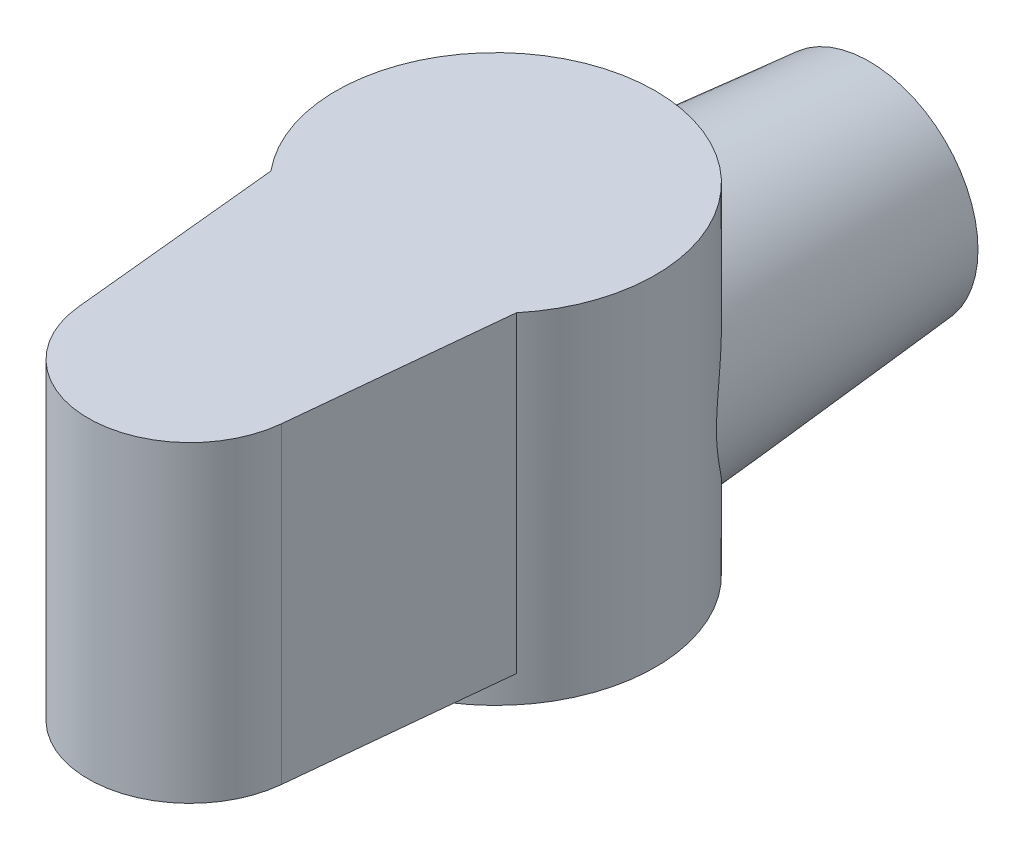
ISO-10303-21;
HEADER;
FILE_DESCRIPTION(('STEP AP214'),'2;1');
FILE_NAME('part.step','',(''),(''),'','','');
FILE_SCHEMA(('AUTOMOTIVE_DESIGN { 1 0 10303 214 1 1 1 1 }'));
ENDSEC;
DATA;
#1=APPLICATION_CONTEXT('core data for automotive mechanical design processes');
#2=APPLICATION_PROTOCOL_DEFINITION('international standard','automotive_design',2000,#1);
#3=PRODUCT_CONTEXT('',#1,'mechanical');
#4=PRODUCT('Part','Part','',(#3));
#5=PRODUCT_RELATED_PRODUCT_CATEGORY('part','',(#4));
#6=PRODUCT_DEFINITION_FORMATION('','',#4);
#7=PRODUCT_DEFINITION_CONTEXT('part definition',#1,'design');
#8=PRODUCT_DEFINITION('design','',#6,#7);
#9=PRODUCT_DEFINITION_SHAPE('','',#8);
#10=(LENGTH_UNIT() NAMED_UNIT(*) SI_UNIT(.MILLI.,.METRE.));
#11=(NAMED_UNIT(*) PLANE_ANGLE_UNIT() SI_UNIT($,.RADIAN.));
#12=(NAMED_UNIT(*) SI_UNIT($,.STERADIAN.) SOLID_ANGLE_UNIT());
#13=UNCERTAINTY_MEASURE_WITH_UNIT(LENGTH_MEASURE(1.E-05),#10,'distance_accuracy_value','');
#14=(GEOMETRIC_REPRESENTATION_CONTEXT(3) GLOBAL_UNCERTAINTY_ASSIGNED_CONTEXT((#13)) GLOBAL_UNIT_ASSIGNED_CONTEXT((#10,
#11,#12)) REPRESENTATION_CONTEXT('',''));
#15=CARTESIAN_POINT('',(0.,0.,0.));
#16=DIRECTION('',(0.,0.,1.));
#17=DIRECTION('',(1.,0.,0.));
#18=AXIS2_PLACEMENT_3D('',#15,#16,#17);
#19=CARTESIAN_POINT('',(0.,-50.,0.));
#20=DIRECTION('',(0.,1.,0.));
#21=DIRECTION('',(0.,0.,1.));
#22=AXIS2_PLACEMENT_3D('',#19,#20,#21);
#23=CYLINDRICAL_SURFACE('',#22,23.5);
#24=CARTESIAN_POINT('',(0.,-46.,0.));
#25=DIRECTION('',(0.,1.,0.));
#26=DIRECTION('',(0.,0.,1.));
#27=AXIS2_PLACEMENT_3D('',#24,#25,#26);
#28=CIRCLE('',#27,23.5);
#29=CARTESIAN_POINT('',(-18.072726341741,-46.,15.0208708994033));
#30=VERTEX_POINT('',#29);
#31=CARTESIAN_POINT('',(18.072726341741,-46.,15.0208708994033));
#32=VERTEX_POINT('',#31);
#33=EDGE_CURVE('E118',#30,#32,#28,.T.);
#34=ORIENTED_EDGE('',*,*,#33,.F.);
#35=DIRECTION('',(0.,1.,0.));
#36=VECTOR('',#35,1.);
#37=CARTESIAN_POINT('',(-18.072726341741,-46.,15.0208708994033));
#38=LINE('',#37,#36);
#39=CARTESIAN_POINT('',(-18.072726341741,0.,15.0208708994033));
#40=VERTEX_POINT('',#39);
#41=EDGE_CURVE('E50',#30,#40,#38,.T.);
#42=ORIENTED_EDGE('',*,*,#41,.T.);
#43=CARTESIAN_POINT('',(0.,0.,0.));
#44=DIRECTION('',(0.,1.,0.));
#45=DIRECTION('',(0.,0.,1.));
#46=AXIS2_PLACEMENT_3D('',#43,#44,#45);
#47=CIRCLE('',#46,23.5);
#48=CARTESIAN_POINT('',(18.072726341741,0.,15.0208708994033));
#49=VERTEX_POINT('',#48);
#50=EDGE_CURVE('E92',#49,#40,#47,.T.);
#51=ORIENTED_EDGE('',*,*,#50,.F.);
#52=DIRECTION('',(0.,1.,0.));
#53=VECTOR('',#52,1.);
#54=CARTESIAN_POINT('',(18.072726341741,-46.,15.0208708994033));
#55=LINE('',#54,#53);
#56=EDGE_CURVE('E99',#32,#49,#55,.T.);
#57=ORIENTED_EDGE('',*,*,#56,.F.);
#58=EDGE_LOOP('',(#34,#42,#51,#57));
#59=FACE_BOUND('',#58,.T.);
#60=CARTESIAN_POINT('',(0.,-50.,0.));
#61=DIRECTION('',(0.,1.,0.));
#62=DIRECTION('',(0.,0.,1.));
#63=AXIS2_PLACEMENT_3D('',#60,#61,#62);
#64=CIRCLE('',#63,23.5);
#65=CARTESIAN_POINT('',(0.,-50.,23.5));
#66=VERTEX_POINT('',#65);
#67=EDGE_CURVE('E106',#66,#66,#64,.T.);
#68=ORIENTED_EDGE('',*,*,#67,.T.);
#69=EDGE_LOOP('',(#68));
#70=FACE_BOUND('',#69,.T.);
#71=CARTESIAN_POINT('',(-13.9539910967169,-41.1610036185308,-18.9086262803765));
#72=CARTESIAN_POINT('',(-13.5829165148276,-41.5192526536064,-19.1824686783776));
#73=CARTESIAN_POINT('',(-13.1958667741782,-41.8648667347995,-19.4512164442041));
#74=CARTESIAN_POINT('',(-12.3898601651501,-42.5290968127998,-19.974290236463));
#75=CARTESIAN_POINT('',(-11.9708947441103,-42.8477055241278,-20.22861236508));
#76=CARTESIAN_POINT('',(-11.1013140724873,-43.4554994312211,-20.7185875423787));
#77=CARTESIAN_POINT('',(-10.6506851989404,-43.7446718295844,-20.9542324613935));
#78=CARTESIAN_POINT('',(-9.95214107270286,-44.1537629773972,-21.2901781557576));
#79=CARTESIAN_POINT('',(-9.71554559116236,-44.2860060851355,-21.3992319389614));
#80=CARTESIAN_POINT('',(-9.23489719525556,-44.5419145376105,-21.6110077511604));
#81=CARTESIAN_POINT('',(-8.99084237278167,-44.6655776606719,-21.7137281394446));
#82=CARTESIAN_POINT('',(-8.34021503634724,-44.9785680248526,-21.9745126787421));
#83=CARTESIAN_POINT('',(-7.92770907132558,-45.160438579233,-22.1268847104973));
#84=CARTESIAN_POINT('',(-7.08531258779405,-45.4980593730151,-22.4108428995902));
#85=CARTESIAN_POINT('',(-6.65542564840877,-45.6538149564048,-22.5424333092151));
#86=CARTESIAN_POINT('',(-5.78050990795193,-45.9370958817592,-22.782477138562));
#87=CARTESIAN_POINT('',(-5.33549343928572,-46.0646436088605,-22.8909489022362));
#88=CARTESIAN_POINT('',(-4.43259704168421,-46.2897323106206,-23.0827871690897));
#89=CARTESIAN_POINT('',(-3.97471702991415,-46.3872730920013,-23.1661535105623));
#90=CARTESIAN_POINT('',(-3.04656527819019,-46.5511776686779,-23.3064362792171));
#91=CARTESIAN_POINT('',(-2.5762368228916,-46.6173562291436,-23.3631955360464));
#92=CARTESIAN_POINT('',(-1.62951471318274,-46.7164607737779,-23.4482523588533));
#93=CARTESIAN_POINT('',(-1.15312103612714,-46.7493866337562,-23.4765498185333));
#94=CARTESIAN_POINT('',(-0.198403214084188,-46.7813435719238,-23.5040140587748));
#95=CARTESIAN_POINT('',(0.279920735654743,-46.7803779963851,-23.5031837152708));
#96=CARTESIAN_POINT('',(1.23433435943657,-46.7445766564185,-23.4724166695118));
#97=CARTESIAN_POINT('',(1.71042416862843,-46.7097429680073,-23.4424817512825));
#98=CARTESIAN_POINT('',(2.61316162011611,-46.6115872412703,-23.3582496733459));
#99=CARTESIAN_POINT('',(3.04036025124108,-46.5511514720051,-23.3064219662541));
#100=CARTESIAN_POINT('',(3.88675327308664,-46.4038073287727,-23.1802976235774));
#101=CARTESIAN_POINT('',(4.30594825307253,-46.3169009117444,-23.10600264897));
#102=CARTESIAN_POINT('',(5.1338996880468,-46.1178465334541,-22.9362526266361));
#103=CARTESIAN_POINT('',(5.54265606013304,-46.0056983717945,-22.8407974109158));
#104=CARTESIAN_POINT('',(6.34769478678301,-45.7576011570426,-22.6302874314475));
#105=CARTESIAN_POINT('',(6.74397639446587,-45.6216506820592,-22.5152314968123));
#106=CARTESIAN_POINT('',(7.5452730181334,-45.3188623653117,-22.25996170931));
#107=CARTESIAN_POINT('',(7.94943434359486,-45.1506795316573,-22.1186672631686));
#108=CARTESIAN_POINT('',(8.74043168130539,-44.7912484671742,-21.8182007644006));
#109=CARTESIAN_POINT('',(9.12726746779063,-44.5999999359033,-21.6590284789081));
#110=CARTESIAN_POINT('',(9.88278291505461,-44.1961199428823,-21.3248985707166));
#111=CARTESIAN_POINT('',(10.251452943331,-43.9834773147508,-21.1499327097078));
#112=CARTESIAN_POINT('',(10.9697780423092,-43.5385168888229,-20.7864399932689));
#113=CARTESIAN_POINT('',(11.3194293222107,-43.3061951920388,-20.5979104516047));
#114=CARTESIAN_POINT('',(12.1595090706911,-42.7095251725459,-20.1178531011592));
#115=CARTESIAN_POINT('',(12.6386346827149,-42.3345500894908,-19.8196532752494));
#116=CARTESIAN_POINT('',(13.5542112849931,-41.5488272275916,-19.2051442292094));
#117=CARTESIAN_POINT('',(13.9906428681123,-41.1380633393965,-18.8888268761477));
#118=CARTESIAN_POINT('',(14.8212810898826,-40.2825326829012,-18.2443528770776));
#119=CARTESIAN_POINT('',(15.2154068672645,-39.8377034884597,-17.9161751067661));
#120=CARTESIAN_POINT('',(15.9601942576284,-38.9159558089643,-17.2559998995906));
#121=CARTESIAN_POINT('',(16.310870570741,-38.4390482616027,-16.9240037963441));
#122=CARTESIAN_POINT('',(16.885746095832,-37.5763004672125,-16.347578147935));
#123=CARTESIAN_POINT('',(17.1196150958211,-37.1975970494084,-16.1020583359283));
#124=CARTESIAN_POINT('',(17.561982467465,-36.420949889296,-15.6183891777407));
#125=CARTESIAN_POINT('',(17.7704774275238,-36.0230035697656,-15.3802408258717));
#126=CARTESIAN_POINT('',(18.1603470590887,-35.2076330257484,-14.9178754900194));
#127=CARTESIAN_POINT('',(18.3417839844029,-34.7902565046596,-14.6936272430121));
#128=CARTESIAN_POINT('',(18.6760046534478,-33.9337294028276,-14.2664025315059));
#129=CARTESIAN_POINT('',(18.8288062132697,-33.4945925772242,-14.0634128754492));
#130=CARTESIAN_POINT('',(19.0475024271744,-32.7747841455668,-13.7645186284262));
#131=CARTESIAN_POINT('',(19.1236272239132,-32.501446604668,-13.6583902135101));
#132=CARTESIAN_POINT('',(19.2636367772409,-31.9465319541191,-13.4602005043009));
#133=CARTESIAN_POINT('',(19.3275197726124,-31.664953665587,-13.3681412345087));
#134=CARTESIAN_POINT('',(19.4418829742243,-31.0946094953808,-13.2012661840788));
#135=CARTESIAN_POINT('',(19.4923884519218,-30.8058583097094,-13.1264179259367));
#136=CARTESIAN_POINT('',(19.5790520586688,-30.2218685464058,-12.9968004152425));
#137=CARTESIAN_POINT('',(19.6152180353774,-29.9266336108055,-12.9420201812022));
#138=CARTESIAN_POINT('',(19.6726284349059,-29.3275544016879,-12.8545904695212));
#139=CARTESIAN_POINT('',(19.6936781620558,-29.0236484534623,-12.8222299357188));
#140=CARTESIAN_POINT('',(19.7194198504004,-28.4135109566668,-12.7826075966193));
#141=CARTESIAN_POINT('',(19.7241132090356,-28.1072796090128,-12.7753436471435));
#142=CARTESIAN_POINT('',(19.7169802768358,-27.4953963827582,-12.7863492669924));
#143=CARTESIAN_POINT('',(19.7051497018932,-27.1897446750149,-12.8046254580287));
#144=CARTESIAN_POINT('',(19.6653666854984,-26.5819632580375,-12.8656382636726));
#145=CARTESIAN_POINT('',(19.6374118159874,-26.2798340862326,-12.9083785621731));
#146=CARTESIAN_POINT('',(19.5618780360293,-25.6448863847979,-13.0226016220116));
#147=CARTESIAN_POINT('',(19.5123197638456,-25.3128250477739,-13.0969566896419));
#148=CARTESIAN_POINT('',(19.3955040666832,-24.6581549154242,-13.2693332419124));
#149=CARTESIAN_POINT('',(19.3282428424673,-24.3355481656875,-13.3673598063285));
#150=CARTESIAN_POINT('',(19.177370179435,-23.6998645047123,-13.5829234171459));
#151=CARTESIAN_POINT('',(19.0937122540159,-23.3868176837625,-13.7005157882943));
#152=CARTESIAN_POINT('',(18.9115046598839,-22.7712551956534,-13.9509486815701));
#153=CARTESIAN_POINT('',(18.8129487740561,-22.4687439902986,-14.0837955640166));
#154=CARTESIAN_POINT('',(18.6174357830843,-21.9174292470656,-14.3409639361534));
#155=CARTESIAN_POINT('',(18.5223366327423,-21.6672207132108,-14.4637088787358));
#156=CARTESIAN_POINT('',(18.3226444574937,-21.174161998795,-14.715862201887));
#157=CARTESIAN_POINT('',(18.218053374818,-20.9313103263836,-14.845269216934));
#158=CARTESIAN_POINT('',(17.8904908081764,-20.2128930704526,-15.2413077035255));
#159=CARTESIAN_POINT('',(17.653827634203,-19.7477372024413,-15.5156258976308));
#160=CARTESIAN_POINT('',(17.1459582795878,-18.8427549632101,-16.0751148556033));
#161=CARTESIAN_POINT('',(16.8747062411952,-18.4029633648892,-16.3602996678786));
#162=CARTESIAN_POINT('',(16.2990003174285,-17.5481479318264,-16.9339219510581));
#163=CARTESIAN_POINT('',(15.9945545650825,-17.1331180684224,-17.2223586097446));
#164=CARTESIAN_POINT('',(15.3292139172226,-16.2977095168137,-17.8179401628425));
#165=CARTESIAN_POINT('',(14.9658126715946,-15.8791895034505,-18.1248977656051));
#166=CARTESIAN_POINT('',(14.2013506361567,-15.0709297044958,-18.7299063262714));
#167=CARTESIAN_POINT('',(13.8002841495058,-14.6811942885305,-19.0279559278305));
#168=CARTESIAN_POINT('',(12.9612455482232,-13.932954366768,-19.6090797926488));
#169=CARTESIAN_POINT('',(12.5233353089366,-13.5743994778539,-19.8921779132037));
#170=CARTESIAN_POINT('',(11.8389046019437,-13.0617485704872,-20.3017503708656));
#171=CARTESIAN_POINT('',(11.6061849457867,-12.8950731769649,-20.4357527640081));
#172=CARTESIAN_POINT('',(11.1315398397183,-12.5704589272456,-20.6981246557077));
#173=CARTESIAN_POINT('',(10.8896121044389,-12.4125222641103,-20.8264927386289));
#174=CARTESIAN_POINT('',(10.2502328698663,-12.0147675650752,-21.1512858911633));
#175=CARTESIAN_POINT('',(9.84579997858435,-11.7820689289342,-21.342819019319));
#176=CARTESIAN_POINT('',(9.01503260162709,-11.3424453456125,-21.7067918312979));
#177=CARTESIAN_POINT('',(8.58870292681354,-11.1355147709498,-21.8792356831079));
#178=CARTESIAN_POINT('',(7.71555880372743,-10.7497748318725,-22.2021781951682));
#179=CARTESIAN_POINT('',(7.26874926953352,-10.570958766618,-22.3526820839863));
#180=CARTESIAN_POINT('',(6.35662089222604,-10.2438582956379,-22.6289729317523));
#181=CARTESIAN_POINT('',(5.89130186537594,-10.0955741930815,-22.7547596452687));
#182=CARTESIAN_POINT('',(4.9410600421991,-9.83084547472503,-22.979909376314));
#183=CARTESIAN_POINT('',(4.45600773308978,-9.71467205627304,-23.0790471428296));
#184=CARTESIAN_POINT('',(3.47355618463939,-9.51795477076562,-23.2472090848752));
#185=CARTESIAN_POINT('',(2.97615688951933,-9.43741106470261,-23.3162331243367));
#186=CARTESIAN_POINT('',(1.9736720548741,-9.31364528350896,-23.4223932305508));
#187=CARTESIAN_POINT('',(1.46859164172374,-9.27039934012632,-23.4595496904905));
#188=CARTESIAN_POINT('',(0.455290218559727,-9.22209293806186,-23.5010580420593));
#189=CARTESIAN_POINT('',(-0.0529303975430453,-9.21702778349913,-23.505413967848));
#190=CARTESIAN_POINT('',(-1.00269326665794,-9.24337090854776,-23.4827740242128));
#191=CARTESIAN_POINT('',(-1.44446787870858,-9.27020704811393,-23.4597082370075));
#192=CARTESIAN_POINT('',(-2.32331372585795,-9.35253901919309,-23.3890251694556));
#193=CARTESIAN_POINT('',(-2.76038543663081,-9.40803192387052,-23.3414103964006));
#194=CARTESIAN_POINT('',(-3.62683987848551,-9.54678994721284,-23.222560147626));
#195=CARTESIAN_POINT('',(-4.05622209169916,-9.63005692903513,-23.1513230872636));
#196=CARTESIAN_POINT('',(-4.90460780933358,-9.82311459688951,-22.9865521074989));
#197=CARTESIAN_POINT('',(-5.3236108295517,-9.93290651778434,-22.8930171500256));
#198=CARTESIAN_POINT('',(-6.15069962170695,-10.1780287848712,-22.6848305732511));
#199=CARTESIAN_POINT('',(-6.55873185042627,-10.3134649661454,-22.5700914923581));
#200=CARTESIAN_POINT('',(-7.36018169028427,-10.6079068426626,-22.3215986723585));
#201=CARTESIAN_POINT('',(-7.75359970807389,-10.76691188147,-22.1878454628344));
#202=CARTESIAN_POINT('',(-8.52445740191273,-11.1068119467974,-21.9032517874788));
#203=CARTESIAN_POINT('',(-8.90189650883431,-11.2877077521263,-21.7524107137239));
#204=CARTESIAN_POINT('',(-9.63982142128544,-11.6697650629109,-21.4356049414395));
#205=CARTESIAN_POINT('',(-10.0003038130171,-11.8709306237627,-21.2696372171382));
#206=CARTESIAN_POINT('',(-10.8588451771563,-12.3849544795799,-20.8483602061073));
#207=CARTESIAN_POINT('',(-11.3474101772964,-12.7079251477356,-20.5859472922086));
#208=CARTESIAN_POINT('',(-12.2866862616545,-13.3888715262822,-20.0395309901683));
#209=CARTESIAN_POINT('',(-12.7373825231019,-13.7468608262749,-19.7555192298027));
#210=CARTESIAN_POINT('',(-13.6017612800166,-14.4959339702297,-19.1706866771735));
#211=CARTESIAN_POINT('',(-14.0153171331134,-14.8871228116404,-18.8698136615899));
#212=CARTESIAN_POINT('',(-14.8035233190009,-15.6994071866442,-18.2579984883335));
#213=CARTESIAN_POINT('',(-15.1781803098962,-16.120497581306,-17.9470580658355));
#214=CARTESIAN_POINT('',(-15.8951178315783,-16.9997684857087,-17.3155314445253));
#215=CARTESIAN_POINT('',(-16.2366667605372,-17.4584930909121,-16.9948733982409));
#216=CARTESIAN_POINT('',(-16.8789679034998,-18.4066415890096,-16.3571091614064));
#217=CARTESIAN_POINT('',(-17.1796993571499,-18.8960809201683,-16.0400048530001));
#218=CARTESIAN_POINT('',(-17.598309773363,-19.6533893432104,-15.5753955164029));
#219=CARTESIAN_POINT('',(-17.7322422026126,-19.9092526558957,-15.4226044189319));
#220=CARTESIAN_POINT('',(-17.9891732434843,-20.4293082744415,-15.1221247262653));
#221=CARTESIAN_POINT('',(-18.1121735839205,-20.6934992543707,-14.9744353265472));
#222=CARTESIAN_POINT('',(-18.3466818013964,-21.2303668418681,-14.6861759956377));
#223=CARTESIAN_POINT('',(-18.4582005481234,-21.5030350994711,-14.5455993960634));
#224=CARTESIAN_POINT('',(-18.6692295059812,-22.0574505631809,-14.2737333095417));
#225=CARTESIAN_POINT('',(-18.7687426809164,-22.3391955066838,-14.1424415337842));
#226=CARTESIAN_POINT('',(-18.948598448743,-22.8925702646758,-13.9004236940797));
#227=CARTESIAN_POINT('',(-19.0297862479974,-23.1635762586358,-13.7889054189869));
#228=CARTESIAN_POINT('',(-19.1801943689271,-23.713856377577,-13.5789111047241));
#229=CARTESIAN_POINT('',(-19.2494160874399,-23.9931295330431,-13.4804335435856));
#230=CARTESIAN_POINT('',(-19.3747878687407,-24.5591808510072,-13.2996125490957));
#231=CARTESIAN_POINT('',(-19.4309622264379,-24.8459439404963,-13.2172391748893));
#232=CARTESIAN_POINT('',(-19.5293042823727,-25.4265928410907,-13.0714966942301));
#233=CARTESIAN_POINT('',(-19.5714760871621,-25.7204765367472,-13.0081220165287));
#234=CARTESIAN_POINT('',(-19.6412626362964,-26.318039349678,-12.9025152501226));
#235=CARTESIAN_POINT('',(-19.668668207095,-26.6217977037908,-12.8605873694062));
#236=CARTESIAN_POINT('',(-19.7071700827031,-27.2327507899298,-12.8015122907884));
#237=CARTESIAN_POINT('',(-19.7182681980407,-27.5399451366601,-12.7843623419313));
#238=CARTESIAN_POINT('',(-19.7237740410175,-28.1547587671682,-12.7758666087209));
#239=CARTESIAN_POINT('',(-19.7181867006058,-28.4623778985198,-12.7845131993297));
#240=CARTESIAN_POINT('',(-19.6905303047695,-29.0751092767413,-12.8270666813698));
#241=CARTESIAN_POINT('',(-19.6684593340011,-29.3802212281193,-12.8609765083051));
#242=CARTESIAN_POINT('',(-19.6063645569687,-30.0073353779568,-12.9554566131401));
#243=CARTESIAN_POINT('',(-19.5651518345842,-30.3289521532288,-13.017786466877));
#244=CARTESIAN_POINT('',(-19.4658738730258,-30.9640113040297,-13.1657776952298));
#245=CARTESIAN_POINT('',(-19.4078059017303,-31.2774523453434,-13.2514428522016));
#246=CARTESIAN_POINT('',(-19.2100047292335,-32.2056612246064,-13.5380661122097));
#247=CARTESIAN_POINT('',(-19.0468676363246,-32.8064958406239,-13.7683379268678));
#248=CARTESIAN_POINT('',(-18.6979611547341,-33.8773557951551,-14.2375590775892));
#249=CARTESIAN_POINT('',(-18.519721461301,-34.3531430898601,-14.4695191118232));
#250=CARTESIAN_POINT('',(-18.1294899156724,-35.2793265571444,-14.9555604205282));
#251=CARTESIAN_POINT('',(-17.9174722168203,-35.7297029252023,-15.2096585668834));
#252=CARTESIAN_POINT('',(-17.462121236839,-36.6063832326327,-15.7303538280325));
#253=CARTESIAN_POINT('',(-17.2187961086189,-37.0326933977555,-15.9969476773142));
#254=CARTESIAN_POINT('',(-16.7021220885002,-37.862623114438,-16.5356714719826));
#255=CARTESIAN_POINT('',(-16.4287868000112,-38.2662528224881,-16.8077988638433));
#256=CARTESIAN_POINT('',(-15.8139641692105,-39.1043317125835,-17.3888066692911));
#257=CARTESIAN_POINT('',(-15.4682525405665,-39.5356619104086,-17.6977250983516));
#258=CARTESIAN_POINT('',(-14.7392692611486,-40.3699353564144,-18.3092968080717));
#259=CARTESIAN_POINT('',(-14.3560052701806,-40.7728843649921,-18.6119513512256));
#260=CARTESIAN_POINT('',(-13.9539910967169,-41.1610036185308,-18.9086262803765));
#261=B_SPLINE_CURVE_WITH_KNOTS('',3,(#71,#72,#73,#74,#75,#76,#77,#78,#79,#80,#81,#82,#83,#84,
#85,#86,#87,#88,#89,#90,#91,#92,#93,#94,#95,#96,#97,#98,#99,#100,#101,#102,#103,#104,#105,#106,
#107,#108,#109,#110,#111,#112,#113,#114,#115,#116,#117,#118,#119,#120,#121,#122,#123,#124,#125,
#126,#127,#128,#129,#130,#131,#132,#133,#134,#135,#136,#137,#138,#139,#140,#141,#142,#143,#144,
#145,#146,#147,#148,#149,#150,#151,#152,#153,#154,#155,#156,#157,#158,#159,#160,#161,#162,#163,
#164,#165,#166,#167,#168,#169,#170,#171,#172,#173,#174,#175,#176,#177,#178,#179,#180,#181,#182,
#183,#184,#185,#186,#187,#188,#189,#190,#191,#192,#193,#194,#195,#196,#197,#198,#199,#200,#201,
#202,#203,#204,#205,#206,#207,#208,#209,#210,#211,#212,#213,#214,#215,#216,#217,#218,#219,#220,
#221,#222,#223,#224,#225,#226,#227,#228,#229,#230,#231,#232,#233,#234,#235,#236,#237,#238,#239,
#240,#241,#242,#243,#244,#245,#246,#247,#248,#249,#250,#251,#252,#253,#254,#255,#256,#257,#258,
#259,#260),.UNSPECIFIED.,.T.,.F.,(4,2,2,2,2,2,2,2,2,2,2,2,2,2,2,2,2,2,2,2,2,2,2,2,2,2,2,2,2,2,2,
2,2,2,2,2,2,2,2,2,2,2,2,2,2,2,2,2,2,2,2,2,2,2,2,2,2,2,2,2,2,2,2,2,2,2,2,2,2,2,2,2,2,2,2,2,2,2,2,
2,2,2,2,2,2,2,2,2,2,2,2,2,2,2,4),(0.,1.75151749927154,3.50350602695912,5.25625300546452,
6.13248961746483,7.00895227923908,8.43507982398725,9.86091517868572,11.2856149287698,
12.7103238553083,14.1433457875298,15.5763730717032,17.0092588662829,18.4420568346724,
19.7442492452952,21.0463454099664,22.3484519125131,23.6506362262223,25.0292890068552,
26.407959747069,27.7873538374471,29.1670218674742,31.1968201012755,33.2275367606233,
35.2620681974977,37.2959094067231,38.8199555388764,40.3442063565612,41.8648942769753,
43.3846329054656,44.2928840209571,45.2012657078146,46.1079189309811,47.0140752777889,
47.9317031219027,48.8492525646492,49.7670399416855,50.6849655588011,51.7149719734735,
52.7451996187119,53.7783914718837,54.8120156860509,55.6950902350179,56.577984495721,
58.3447211182014,60.1138249111143,61.8824962132899,63.7814732667831,65.6807380032039,
67.576874459855,68.524803199904,69.4729687620122,70.9846242468169,72.495949020337,
74.0069130353791,75.5178920529171,77.0412674000449,78.5646496304557,80.0870562659496,
81.6092756565716,82.9372339145028,84.2650565693062,85.5929683158296,86.9209418949106,
88.2545205015894,89.5880619726443,90.9216509011182,92.2555071742349,94.1780246893178,
96.1012912537565,98.0308848215432,99.9601475650199,101.925285569801,103.891419356205,
104.871331514296,105.851088431097,106.829909108759,107.808487649253,108.720216353991,
109.631838557848,110.541749412837,111.451393180579,112.373604781411,113.295713986362,
114.217550657824,115.139494460347,116.128488369538,117.117642677552,119.101448587406,
120.775000334098,122.449838874649,124.124242142361,125.797889523403,127.69583201958,
129.593388182527),.UNSPECIFIED.);
#262=CARTESIAN_POINT('',(-13.9539910967169,-41.1610036185308,-18.9086262803765));
#263=VERTEX_POINT('',#262);
#264=EDGE_CURVE('E11',#263,#263,#261,.T.);
#265=ORIENTED_EDGE('',*,*,#264,.T.);
#266=EDGE_LOOP('',(#265));
#267=FACE_BOUND('',#266,.T.);
#268=ADVANCED_FACE('F36',(#59,#70,#267),#23,.T.);
#269=CARTESIAN_POINT('',(-19.3810033977043,-46.,1.93810033977043));
#270=DIRECTION('',(-0.995037190209989,0.,0.0995037190209989));
#271=DIRECTION('',(0.0995037190209989,0.,0.995037190209989));
#272=AXIS2_PLACEMENT_3D('',#269,#270,#271);
#273=PLANE('',#272);
#274=DIRECTION('',(0.0995037190209989,0.,0.995037190209989));
#275=VECTOR('',#274,1.);
#276=CARTESIAN_POINT('',(-19.3810033977043,0.,1.93810033977043));
#277=LINE('',#276,#275);
#278=CARTESIAN_POINT('',(-14.9255578531498,0.,46.492555785315));
#279=VERTEX_POINT('',#278);
#280=EDGE_CURVE('E77',#40,#279,#277,.T.);
#281=ORIENTED_EDGE('',*,*,#280,.F.);
#282=ORIENTED_EDGE('',*,*,#41,.F.);
#283=DIRECTION('',(0.0995037190209989,0.,0.995037190209989));
#284=VECTOR('',#283,1.);
#285=CARTESIAN_POINT('',(-19.3810033977043,-46.,1.93810033977043));
#286=LINE('',#285,#284);
#287=CARTESIAN_POINT('',(-14.9255578531498,-46.,46.492555785315));
#288=VERTEX_POINT('',#287);
#289=EDGE_CURVE('E95',#30,#288,#286,.T.);
#290=ORIENTED_EDGE('',*,*,#289,.T.);
#291=DIRECTION('',(0.,1.,0.));
#292=VECTOR('',#291,1.);
#293=CARTESIAN_POINT('',(-14.9255578531498,-46.,46.492555785315));
#294=LINE('',#293,#292);
#295=EDGE_CURVE('E80',#288,#279,#294,.T.);
#296=ORIENTED_EDGE('',*,*,#295,.T.);
#297=EDGE_LOOP('',(#281,#282,#290,#296));
#298=FACE_BOUND('',#297,.T.);
#299=ADVANCED_FACE('F38',(#298),#273,.T.);
#300=CARTESIAN_POINT('',(19.3810033977043,-46.,1.93810033977043));
#301=DIRECTION('',(-0.995037190209989,0.,-0.099503719020999));
#302=DIRECTION('',(-0.099503719020999,0.,0.995037190209989));
#303=AXIS2_PLACEMENT_3D('',#300,#301,#302);
#304=PLANE('',#303);
#305=DIRECTION('',(-0.099503719020999,0.,0.995037190209989));
#306=VECTOR('',#305,1.);
#307=CARTESIAN_POINT('',(19.3810033977043,0.,1.93810033977043));
#308=LINE('',#307,#306);
#309=CARTESIAN_POINT('',(14.9255578531498,0.,46.4925557853149));
#310=VERTEX_POINT('',#309);
#311=EDGE_CURVE('E88',#49,#310,#308,.T.);
#312=ORIENTED_EDGE('',*,*,#311,.T.);
#313=DIRECTION('',(0.,1.,0.));
#314=VECTOR('',#313,1.);
#315=CARTESIAN_POINT('',(14.9255578531498,-46.,46.4925557853149));
#316=LINE('',#315,#314);
#317=CARTESIAN_POINT('',(14.9255578531498,-46.,46.4925557853149));
#318=VERTEX_POINT('',#317);
#319=EDGE_CURVE('E73',#318,#310,#316,.T.);
#320=ORIENTED_EDGE('',*,*,#319,.F.);
#321=DIRECTION('',(-0.099503719020999,0.,0.995037190209989));
#322=VECTOR('',#321,1.);
#323=CARTESIAN_POINT('',(19.3810033977043,-46.,1.93810033977043));
#324=LINE('',#323,#322);
#325=EDGE_CURVE('E101',#32,#318,#324,.T.);
#326=ORIENTED_EDGE('',*,*,#325,.F.);
#327=ORIENTED_EDGE('',*,*,#56,.T.);
#328=EDGE_LOOP('',(#312,#320,#326,#327));
#329=FACE_BOUND('',#328,.T.);
#330=ADVANCED_FACE('F100',(#329),#304,.F.);
#331=CARTESIAN_POINT('',(0.,-46.,45.));
#332=DIRECTION('',(0.,1.,0.));
#333=DIRECTION('',(0.,0.,1.));
#334=AXIS2_PLACEMENT_3D('',#331,#332,#333);
#335=CYLINDRICAL_SURFACE('',#334,15.);
#336=CARTESIAN_POINT('',(0.,0.,45.));
#337=DIRECTION('',(0.,1.,0.));
#338=DIRECTION('',(0.,0.,1.));
#339=AXIS2_PLACEMENT_3D('',#336,#337,#338);
#340=CIRCLE('',#339,15.);
#341=EDGE_CURVE('E93',#279,#310,#340,.T.);
#342=ORIENTED_EDGE('',*,*,#341,.F.);
#343=ORIENTED_EDGE('',*,*,#295,.F.);
#344=CARTESIAN_POINT('',(0.,-46.,45.));
#345=DIRECTION('',(0.,1.,0.));
#346=DIRECTION('',(0.,0.,1.));
#347=AXIS2_PLACEMENT_3D('',#344,#345,#346);
#348=CIRCLE('',#347,15.);
#349=EDGE_CURVE('E115',#288,#318,#348,.T.);
#350=ORIENTED_EDGE('',*,*,#349,.T.);
#351=ORIENTED_EDGE('',*,*,#319,.T.);
#352=EDGE_LOOP('',(#342,#343,#350,#351));
#353=FACE_BOUND('',#352,.T.);
#354=ADVANCED_FACE('F123',(#353),#335,.T.);
#355=CARTESIAN_POINT('',(0.,-46.,0.));
#356=DIRECTION('',(0.,1.,0.));
#357=DIRECTION('',(0.,0.,1.));
#358=AXIS2_PLACEMENT_3D('',#355,#356,#357);
#359=PLANE('',#358);
#360=ORIENTED_EDGE('',*,*,#289,.F.);
#361=ORIENTED_EDGE('',*,*,#33,.T.);
#362=ORIENTED_EDGE('',*,*,#325,.T.);
#363=ORIENTED_EDGE('',*,*,#349,.F.);
#364=EDGE_LOOP('',(#360,#361,#362,#363));
#365=FACE_BOUND('',#364,.T.);
#366=ADVANCED_FACE('F125',(#365),#359,.F.);
#367=CARTESIAN_POINT('',(0.,0.,0.));
#368=DIRECTION('',(0.,1.,0.));
#369=DIRECTION('',(0.,0.,1.));
#370=AXIS2_PLACEMENT_3D('',#367,#368,#369);
#371=PLANE('',#370);
#372=ORIENTED_EDGE('',*,*,#280,.T.);
#373=ORIENTED_EDGE('',*,*,#341,.T.);
#374=ORIENTED_EDGE('',*,*,#311,.F.);
#375=ORIENTED_EDGE('',*,*,#50,.T.);
#376=EDGE_LOOP('',(#372,#373,#374,#375));
#377=FACE_BOUND('',#376,.T.);
#378=ADVANCED_FACE('F90',(#377),#371,.T.);
#379=CARTESIAN_POINT('',(0.,-50.,0.));
#380=DIRECTION('',(0.,1.,0.));
#381=DIRECTION('',(0.,0.,1.));
#382=AXIS2_PLACEMENT_3D('',#379,#380,#381);
#383=PLANE('',#382);
#384=ORIENTED_EDGE('',*,*,#67,.F.);
#385=EDGE_LOOP('',(#384));
#386=FACE_BOUND('',#385,.T.);
#387=ADVANCED_FACE('F139',(#386),#383,.F.);
#388=CARTESIAN_POINT('',(0.,-28.,-55.));
#389=DIRECTION('',(0.,0.,1.));
#390=DIRECTION('',(1.,0.,0.));
#391=AXIS2_PLACEMENT_3D('',#388,#389,#390);
#392=PLANE('',#391);
#393=CARTESIAN_POINT('',(0.,-28.,-55.));
#394=DIRECTION('',(0.,0.,1.));
#395=DIRECTION('',(1.,0.,0.));
#396=AXIS2_PLACEMENT_3D('',#393,#394,#395);
#397=CIRCLE('',#396,16.);
#398=CARTESIAN_POINT('',(16.,-28.,-55.));
#399=VERTEX_POINT('',#398);
#400=EDGE_CURVE('E107',#399,#399,#397,.T.);
#401=ORIENTED_EDGE('',*,*,#400,.F.);
#402=EDGE_LOOP('',(#401));
#403=FACE_BOUND('',#402,.T.);
#404=ADVANCED_FACE('F146',(#403),#392,.F.);
#405=CARTESIAN_POINT('',(0.,-28.,-55.));
#406=DIRECTION('',(0.,0.,1.));
#407=DIRECTION('',(1.,0.,0.));
#408=AXIS2_PLACEMENT_3D('',#405,#406,#407);
#409=CONICAL_SURFACE('',#408,16.,0.0879210684790431);
#410=ORIENTED_EDGE('',*,*,#264,.F.);
#411=EDGE_LOOP('',(#410));
#412=FACE_BOUND('',#411,.T.);
#413=ORIENTED_EDGE('',*,*,#400,.T.);
#414=EDGE_LOOP('',(#413));
#415=FACE_BOUND('',#414,.T.);
#416=ADVANCED_FACE('F151',(#412,#415),#409,.T.);
#417=CLOSED_SHELL('',(#268,#299,#330,#354,#366,#378,#387,#404,#416));
#418=MANIFOLD_SOLID_BREP('B2',#417);
#419=ADVANCED_BREP_SHAPE_REPRESENTATION('',(#18,#418),#14);
#420=SHAPE_DEFINITION_REPRESENTATION(#9,#419);
ENDSEC;
END-ISO-10303-21;
